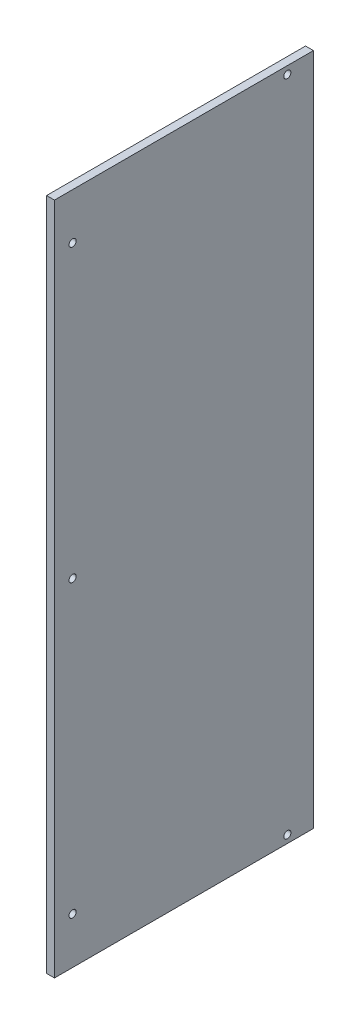
ISO-10303-21;
HEADER;
FILE_DESCRIPTION(('STEP AP214'),'2;1');
FILE_NAME('part.step','',(''),(''),'','','');
FILE_SCHEMA(('AUTOMOTIVE_DESIGN { 1 0 10303 214 1 1 1 1 }'));
ENDSEC;
DATA;
#1=APPLICATION_CONTEXT('core data for automotive mechanical design processes');
#2=APPLICATION_PROTOCOL_DEFINITION('international standard','automotive_design',2000,#1);
#3=PRODUCT_CONTEXT('',#1,'mechanical');
#4=PRODUCT('Part','Part','',(#3));
#5=PRODUCT_RELATED_PRODUCT_CATEGORY('part','',(#4));
#6=PRODUCT_DEFINITION_FORMATION('','',#4);
#7=PRODUCT_DEFINITION_CONTEXT('part definition',#1,'design');
#8=PRODUCT_DEFINITION('design','',#6,#7);
#9=PRODUCT_DEFINITION_SHAPE('','',#8);
#10=(LENGTH_UNIT() NAMED_UNIT(*) SI_UNIT(.MILLI.,.METRE.));
#11=(NAMED_UNIT(*) PLANE_ANGLE_UNIT() SI_UNIT($,.RADIAN.));
#12=(NAMED_UNIT(*) SI_UNIT($,.STERADIAN.) SOLID_ANGLE_UNIT());
#13=UNCERTAINTY_MEASURE_WITH_UNIT(LENGTH_MEASURE(1.E-05),#10,'distance_accuracy_value','');
#14=(GEOMETRIC_REPRESENTATION_CONTEXT(3) GLOBAL_UNCERTAINTY_ASSIGNED_CONTEXT((#13)) GLOBAL_UNIT_ASSIGNED_CONTEXT((#10,
#11,#12)) REPRESENTATION_CONTEXT('',''));
#15=CARTESIAN_POINT('',(0.,0.,0.));
#16=DIRECTION('',(0.,0.,1.));
#17=DIRECTION('',(1.,0.,0.));
#18=AXIS2_PLACEMENT_3D('',#15,#16,#17);
#19=CARTESIAN_POINT('',(4.7625,226.164383561644,-138.347836600095));
#20=DIRECTION('',(0.,0.,-1.));
#21=DIRECTION('',(0.,1.,0.));
#22=AXIS2_PLACEMENT_3D('',#19,#20,#21);
#23=PLANE('',#22);
#24=DIRECTION('',(0.,-1.,0.));
#25=VECTOR('',#24,1.);
#26=CARTESIAN_POINT('',(0.,226.164383561644,-138.347836600095));
#27=LINE('',#26,#25);
#28=CARTESIAN_POINT('',(0.,226.164383561644,-138.347836600095));
#29=VERTEX_POINT('',#28);
#30=CARTESIAN_POINT('',(0.,-180.235616438356,-138.347836600095));
#31=VERTEX_POINT('',#30);
#32=EDGE_CURVE('E97',#29,#31,#27,.T.);
#33=ORIENTED_EDGE('',*,*,#32,.T.);
#34=DIRECTION('',(-1.,0.,0.));
#35=VECTOR('',#34,1.);
#36=CARTESIAN_POINT('',(4.7625,-180.235616438356,-138.347836600095));
#37=LINE('',#36,#35);
#38=CARTESIAN_POINT('',(4.7625,-180.235616438356,-138.347836600095));
#39=VERTEX_POINT('',#38);
#40=EDGE_CURVE('E11',#39,#31,#37,.T.);
#41=ORIENTED_EDGE('',*,*,#40,.F.);
#42=DIRECTION('',(0.,-1.,0.));
#43=VECTOR('',#42,1.);
#44=CARTESIAN_POINT('',(4.7625,226.164383561644,-138.347836600095));
#45=LINE('',#44,#43);
#46=CARTESIAN_POINT('',(4.7625,226.164383561644,-138.347836600095));
#47=VERTEX_POINT('',#46);
#48=EDGE_CURVE('E85',#47,#39,#45,.T.);
#49=ORIENTED_EDGE('',*,*,#48,.F.);
#50=DIRECTION('',(-1.,0.,0.));
#51=VECTOR('',#50,1.);
#52=CARTESIAN_POINT('',(4.7625,226.164383561644,-138.347836600095));
#53=LINE('',#52,#51);
#54=EDGE_CURVE('E93',#47,#29,#53,.T.);
#55=ORIENTED_EDGE('',*,*,#54,.T.);
#56=EDGE_LOOP('',(#33,#41,#49,#55));
#57=FACE_BOUND('',#56,.T.);
#58=ADVANCED_FACE('F34',(#57),#23,.F.);
#59=CARTESIAN_POINT('',(4.7625,-180.235616438356,-138.347836600095));
#60=DIRECTION('',(0.,1.,0.));
#61=DIRECTION('',(0.,0.,1.));
#62=AXIS2_PLACEMENT_3D('',#59,#60,#61);
#63=PLANE('',#62);
#64=DIRECTION('',(0.,0.,-1.));
#65=VECTOR('',#64,1.);
#66=CARTESIAN_POINT('',(0.,-180.235616438356,-138.347836600095));
#67=LINE('',#66,#65);
#68=CARTESIAN_POINT('',(0.,-180.235616438356,-294.557836600095));
#69=VERTEX_POINT('',#68);
#70=EDGE_CURVE('E89',#31,#69,#67,.T.);
#71=ORIENTED_EDGE('',*,*,#70,.T.);
#72=DIRECTION('',(-1.,0.,0.));
#73=VECTOR('',#72,1.);
#74=CARTESIAN_POINT('',(4.7625,-180.235616438356,-294.557836600095));
#75=LINE('',#74,#73);
#76=CARTESIAN_POINT('',(4.7625,-180.235616438356,-294.557836600095));
#77=VERTEX_POINT('',#76);
#78=EDGE_CURVE('E42',#77,#69,#75,.T.);
#79=ORIENTED_EDGE('',*,*,#78,.F.);
#80=DIRECTION('',(0.,0.,-1.));
#81=VECTOR('',#80,1.);
#82=CARTESIAN_POINT('',(4.7625,-180.235616438356,-138.347836600095));
#83=LINE('',#82,#81);
#84=EDGE_CURVE('E80',#39,#77,#83,.T.);
#85=ORIENTED_EDGE('',*,*,#84,.F.);
#86=ORIENTED_EDGE('',*,*,#40,.T.);
#87=EDGE_LOOP('',(#71,#79,#85,#86));
#88=FACE_BOUND('',#87,.T.);
#89=ADVANCED_FACE('F88',(#88),#63,.F.);
#90=CARTESIAN_POINT('',(4.7625,226.164383561644,-294.557836600095));
#91=DIRECTION('',(0.,0.,1.));
#92=DIRECTION('',(1.,0.,0.));
#93=AXIS2_PLACEMENT_3D('',#90,#91,#92);
#94=PLANE('',#93);
#95=DIRECTION('',(0.,1.,0.));
#96=VECTOR('',#95,1.);
#97=CARTESIAN_POINT('',(0.,226.164383561644,-294.557836600095));
#98=LINE('',#97,#96);
#99=CARTESIAN_POINT('',(0.,226.164383561644,-294.557836600095));
#100=VERTEX_POINT('',#99);
#101=EDGE_CURVE('E67',#69,#100,#98,.T.);
#102=ORIENTED_EDGE('',*,*,#101,.T.);
#103=DIRECTION('',(-1.,0.,0.));
#104=VECTOR('',#103,1.);
#105=CARTESIAN_POINT('',(4.7625,226.164383561644,-294.557836600095));
#106=LINE('',#105,#104);
#107=CARTESIAN_POINT('',(4.7625,226.164383561644,-294.557836600095));
#108=VERTEX_POINT('',#107);
#109=EDGE_CURVE('E90',#108,#100,#106,.T.);
#110=ORIENTED_EDGE('',*,*,#109,.F.);
#111=DIRECTION('',(0.,1.,0.));
#112=VECTOR('',#111,1.);
#113=CARTESIAN_POINT('',(4.7625,226.164383561644,-294.557836600095));
#114=LINE('',#113,#112);
#115=EDGE_CURVE('E83',#77,#108,#114,.T.);
#116=ORIENTED_EDGE('',*,*,#115,.F.);
#117=ORIENTED_EDGE('',*,*,#78,.T.);
#118=EDGE_LOOP('',(#102,#110,#116,#117));
#119=FACE_BOUND('',#118,.T.);
#120=ADVANCED_FACE('F91',(#119),#94,.F.);
#121=CARTESIAN_POINT('',(4.7625,226.164383561644,-138.347836600095));
#122=DIRECTION('',(0.,-1.,0.));
#123=DIRECTION('',(0.,0.,-1.));
#124=AXIS2_PLACEMENT_3D('',#121,#122,#123);
#125=PLANE('',#124);
#126=DIRECTION('',(0.,0.,1.));
#127=VECTOR('',#126,1.);
#128=CARTESIAN_POINT('',(0.,226.164383561644,-138.347836600095));
#129=LINE('',#128,#127);
#130=EDGE_CURVE('E73',#100,#29,#129,.T.);
#131=ORIENTED_EDGE('',*,*,#130,.T.);
#132=ORIENTED_EDGE('',*,*,#54,.F.);
#133=DIRECTION('',(0.,0.,1.));
#134=VECTOR('',#133,1.);
#135=CARTESIAN_POINT('',(4.7625,226.164383561644,-138.347836600095));
#136=LINE('',#135,#134);
#137=EDGE_CURVE('E50',#108,#47,#136,.T.);
#138=ORIENTED_EDGE('',*,*,#137,.F.);
#139=ORIENTED_EDGE('',*,*,#109,.T.);
#140=EDGE_LOOP('',(#131,#132,#138,#139));
#141=FACE_BOUND('',#140,.T.);
#142=ADVANCED_FACE('F105',(#141),#125,.F.);
#143=CARTESIAN_POINT('',(4.7625,0.,0.));
#144=DIRECTION('',(1.,0.,0.));
#145=DIRECTION('',(0.,0.,-1.));
#146=AXIS2_PLACEMENT_3D('',#143,#144,#145);
#147=PLANE('',#146);
#148=CARTESIAN_POINT('',(4.7625,198.351383561644,-149.269836600095));
#149=DIRECTION('',(-1.,0.,0.));
#150=DIRECTION('',(0.,0.,1.));
#151=AXIS2_PLACEMENT_3D('',#148,#149,#150);
#152=CIRCLE('',#151,2.15265000000001);
#153=CARTESIAN_POINT('',(4.7625,198.351383561644,-147.117186600095));
#154=VERTEX_POINT('',#153);
#155=EDGE_CURVE('E134',#154,#154,#152,.T.);
#156=ORIENTED_EDGE('',*,*,#155,.T.);
#157=EDGE_LOOP('',(#156));
#158=FACE_BOUND('',#157,.T.);
#159=CARTESIAN_POINT('',(4.7625,-152.168616438356,-149.269836600095));
#160=DIRECTION('',(-1.,0.,0.));
#161=DIRECTION('',(0.,0.,1.));
#162=AXIS2_PLACEMENT_3D('',#159,#160,#161);
#163=CIRCLE('',#162,2.15265000000001);
#164=CARTESIAN_POINT('',(4.7625,-152.168616438356,-147.117186600095));
#165=VERTEX_POINT('',#164);
#166=EDGE_CURVE('E128',#165,#165,#163,.T.);
#167=ORIENTED_EDGE('',*,*,#166,.T.);
#168=EDGE_LOOP('',(#167));
#169=FACE_BOUND('',#168,.T.);
#170=CARTESIAN_POINT('',(4.7625,23.0913835616439,-149.269836600095));
#171=DIRECTION('',(-1.,0.,0.));
#172=DIRECTION('',(0.,0.,1.));
#173=AXIS2_PLACEMENT_3D('',#170,#171,#172);
#174=CIRCLE('',#173,2.15265);
#175=CARTESIAN_POINT('',(4.7625,23.0913835616439,-147.117186600095));
#176=VERTEX_POINT('',#175);
#177=EDGE_CURVE('E122',#176,#176,#174,.T.);
#178=ORIENTED_EDGE('',*,*,#177,.T.);
#179=EDGE_LOOP('',(#178));
#180=FACE_BOUND('',#179,.T.);
#181=CARTESIAN_POINT('',(4.7625,221.528883561644,-278.809836600095));
#182=DIRECTION('',(-1.,0.,0.));
#183=DIRECTION('',(0.,0.,1.));
#184=AXIS2_PLACEMENT_3D('',#181,#182,#183);
#185=CIRCLE('',#184,2.15265000000001);
#186=CARTESIAN_POINT('',(4.7625,221.528883561644,-276.657186600095));
#187=VERTEX_POINT('',#186);
#188=EDGE_CURVE('E116',#187,#187,#185,.T.);
#189=ORIENTED_EDGE('',*,*,#188,.T.);
#190=EDGE_LOOP('',(#189));
#191=FACE_BOUND('',#190,.T.);
#192=CARTESIAN_POINT('',(4.7625,-175.600116438356,-278.809836600095));
#193=DIRECTION('',(-1.,0.,0.));
#194=DIRECTION('',(0.,0.,1.));
#195=AXIS2_PLACEMENT_3D('',#192,#193,#194);
#196=CIRCLE('',#195,2.15265000000001);
#197=CARTESIAN_POINT('',(4.7625,-175.600116438356,-276.657186600095));
#198=VERTEX_POINT('',#197);
#199=EDGE_CURVE('E100',#198,#198,#196,.T.);
#200=ORIENTED_EDGE('',*,*,#199,.T.);
#201=EDGE_LOOP('',(#200));
#202=FACE_BOUND('',#201,.T.);
#203=ORIENTED_EDGE('',*,*,#48,.T.);
#204=ORIENTED_EDGE('',*,*,#84,.T.);
#205=ORIENTED_EDGE('',*,*,#115,.T.);
#206=ORIENTED_EDGE('',*,*,#137,.T.);
#207=EDGE_LOOP('',(#203,#204,#205,#206));
#208=FACE_BOUND('',#207,.T.);
#209=ADVANCED_FACE('F81',(#158,#169,#180,#191,#202,#208),#147,.T.);
#210=CARTESIAN_POINT('',(0.,0.,0.));
#211=DIRECTION('',(1.,0.,0.));
#212=DIRECTION('',(0.,0.,-1.));
#213=AXIS2_PLACEMENT_3D('',#210,#211,#212);
#214=PLANE('',#213);
#215=CARTESIAN_POINT('',(0.,198.351383561644,-149.269836600095));
#216=DIRECTION('',(-1.,0.,0.));
#217=DIRECTION('',(0.,0.,1.));
#218=AXIS2_PLACEMENT_3D('',#215,#216,#217);
#219=CIRCLE('',#218,2.15264999999998);
#220=CARTESIAN_POINT('',(0.,198.351383561644,-147.117186600095));
#221=VERTEX_POINT('',#220);
#222=EDGE_CURVE('E137',#221,#221,#219,.T.);
#223=ORIENTED_EDGE('',*,*,#222,.F.);
#224=EDGE_LOOP('',(#223));
#225=FACE_BOUND('',#224,.T.);
#226=CARTESIAN_POINT('',(0.,-152.168616438356,-149.269836600095));
#227=DIRECTION('',(-1.,0.,0.));
#228=DIRECTION('',(0.,0.,1.));
#229=AXIS2_PLACEMENT_3D('',#226,#227,#228);
#230=CIRCLE('',#229,2.15264999999998);
#231=CARTESIAN_POINT('',(0.,-152.168616438356,-147.117186600095));
#232=VERTEX_POINT('',#231);
#233=EDGE_CURVE('E131',#232,#232,#230,.T.);
#234=ORIENTED_EDGE('',*,*,#233,.F.);
#235=EDGE_LOOP('',(#234));
#236=FACE_BOUND('',#235,.T.);
#237=CARTESIAN_POINT('',(0.,23.0913835616439,-149.269836600095));
#238=DIRECTION('',(-1.,0.,0.));
#239=DIRECTION('',(0.,0.,1.));
#240=AXIS2_PLACEMENT_3D('',#237,#238,#239);
#241=CIRCLE('',#240,2.15264999999999);
#242=CARTESIAN_POINT('',(0.,23.0913835616439,-147.117186600095));
#243=VERTEX_POINT('',#242);
#244=EDGE_CURVE('E125',#243,#243,#241,.T.);
#245=ORIENTED_EDGE('',*,*,#244,.F.);
#246=EDGE_LOOP('',(#245));
#247=FACE_BOUND('',#246,.T.);
#248=CARTESIAN_POINT('',(0.,221.528883561644,-278.809836600095));
#249=DIRECTION('',(-1.,0.,0.));
#250=DIRECTION('',(0.,0.,1.));
#251=AXIS2_PLACEMENT_3D('',#248,#249,#250);
#252=CIRCLE('',#251,2.15264999999998);
#253=CARTESIAN_POINT('',(0.,221.528883561644,-276.657186600095));
#254=VERTEX_POINT('',#253);
#255=EDGE_CURVE('E119',#254,#254,#252,.T.);
#256=ORIENTED_EDGE('',*,*,#255,.F.);
#257=EDGE_LOOP('',(#256));
#258=FACE_BOUND('',#257,.T.);
#259=CARTESIAN_POINT('',(0.,-175.600116438356,-278.809836600095));
#260=DIRECTION('',(-1.,0.,0.));
#261=DIRECTION('',(0.,0.,1.));
#262=AXIS2_PLACEMENT_3D('',#259,#260,#261);
#263=CIRCLE('',#262,2.15264999999998);
#264=CARTESIAN_POINT('',(0.,-175.600116438356,-276.657186600095));
#265=VERTEX_POINT('',#264);
#266=EDGE_CURVE('E113',#265,#265,#263,.T.);
#267=ORIENTED_EDGE('',*,*,#266,.F.);
#268=EDGE_LOOP('',(#267));
#269=FACE_BOUND('',#268,.T.);
#270=ORIENTED_EDGE('',*,*,#32,.F.);
#271=ORIENTED_EDGE('',*,*,#130,.F.);
#272=ORIENTED_EDGE('',*,*,#101,.F.);
#273=ORIENTED_EDGE('',*,*,#70,.F.);
#274=EDGE_LOOP('',(#270,#271,#272,#273));
#275=FACE_BOUND('',#274,.T.);
#276=ADVANCED_FACE('F108',(#225,#236,#247,#258,#269,#275),#214,.F.);
#277=CARTESIAN_POINT('',(0.,-175.600116438356,-278.809836600095));
#278=DIRECTION('',(-1.,0.,0.));
#279=DIRECTION('',(0.,0.,1.));
#280=AXIS2_PLACEMENT_3D('',#277,#278,#279);
#281=CYLINDRICAL_SURFACE('',#280,2.15264999999999);
#282=ORIENTED_EDGE('',*,*,#199,.F.);
#283=EDGE_LOOP('',(#282));
#284=FACE_BOUND('',#283,.T.);
#285=ORIENTED_EDGE('',*,*,#266,.T.);
#286=EDGE_LOOP('',(#285));
#287=FACE_BOUND('',#286,.T.);
#288=ADVANCED_FACE('F145',(#284,#287),#281,.F.);
#289=CARTESIAN_POINT('',(0.,221.528883561644,-278.809836600095));
#290=DIRECTION('',(-1.,0.,0.));
#291=DIRECTION('',(0.,0.,1.));
#292=AXIS2_PLACEMENT_3D('',#289,#290,#291);
#293=CYLINDRICAL_SURFACE('',#292,2.15264999999999);
#294=ORIENTED_EDGE('',*,*,#188,.F.);
#295=EDGE_LOOP('',(#294));
#296=FACE_BOUND('',#295,.T.);
#297=ORIENTED_EDGE('',*,*,#255,.T.);
#298=EDGE_LOOP('',(#297));
#299=FACE_BOUND('',#298,.T.);
#300=ADVANCED_FACE('F156',(#296,#299),#293,.F.);
#301=CARTESIAN_POINT('',(0.,23.0913835616439,-149.269836600095));
#302=DIRECTION('',(-1.,0.,0.));
#303=DIRECTION('',(0.,0.,1.));
#304=AXIS2_PLACEMENT_3D('',#301,#302,#303);
#305=CYLINDRICAL_SURFACE('',#304,2.15264999999999);
#306=ORIENTED_EDGE('',*,*,#177,.F.);
#307=EDGE_LOOP('',(#306));
#308=FACE_BOUND('',#307,.T.);
#309=ORIENTED_EDGE('',*,*,#244,.T.);
#310=EDGE_LOOP('',(#309));
#311=FACE_BOUND('',#310,.T.);
#312=ADVANCED_FACE('F162',(#308,#311),#305,.F.);
#313=CARTESIAN_POINT('',(0.,-152.168616438356,-149.269836600095));
#314=DIRECTION('',(-1.,0.,0.));
#315=DIRECTION('',(0.,0.,1.));
#316=AXIS2_PLACEMENT_3D('',#313,#314,#315);
#317=CYLINDRICAL_SURFACE('',#316,2.15264999999999);
#318=ORIENTED_EDGE('',*,*,#166,.F.);
#319=EDGE_LOOP('',(#318));
#320=FACE_BOUND('',#319,.T.);
#321=ORIENTED_EDGE('',*,*,#233,.T.);
#322=EDGE_LOOP('',(#321));
#323=FACE_BOUND('',#322,.T.);
#324=ADVANCED_FACE('F193',(#320,#323),#317,.F.);
#325=CARTESIAN_POINT('',(0.,198.351383561644,-149.269836600095));
#326=DIRECTION('',(-1.,0.,0.));
#327=DIRECTION('',(0.,0.,1.));
#328=AXIS2_PLACEMENT_3D('',#325,#326,#327);
#329=CYLINDRICAL_SURFACE('',#328,2.15264999999999);
#330=ORIENTED_EDGE('',*,*,#155,.F.);
#331=EDGE_LOOP('',(#330));
#332=FACE_BOUND('',#331,.T.);
#333=ORIENTED_EDGE('',*,*,#222,.T.);
#334=EDGE_LOOP('',(#333));
#335=FACE_BOUND('',#334,.T.);
#336=ADVANCED_FACE('F141',(#332,#335),#329,.F.);
#337=CLOSED_SHELL('',(#58,#89,#120,#142,#209,#276,#288,#300,#312,#324,#336));
#338=MANIFOLD_SOLID_BREP('B2',#337);
#339=ADVANCED_BREP_SHAPE_REPRESENTATION('',(#18,#338),#14);
#340=SHAPE_DEFINITION_REPRESENTATION(#9,#339);
ENDSEC;
END-ISO-10303-21;
